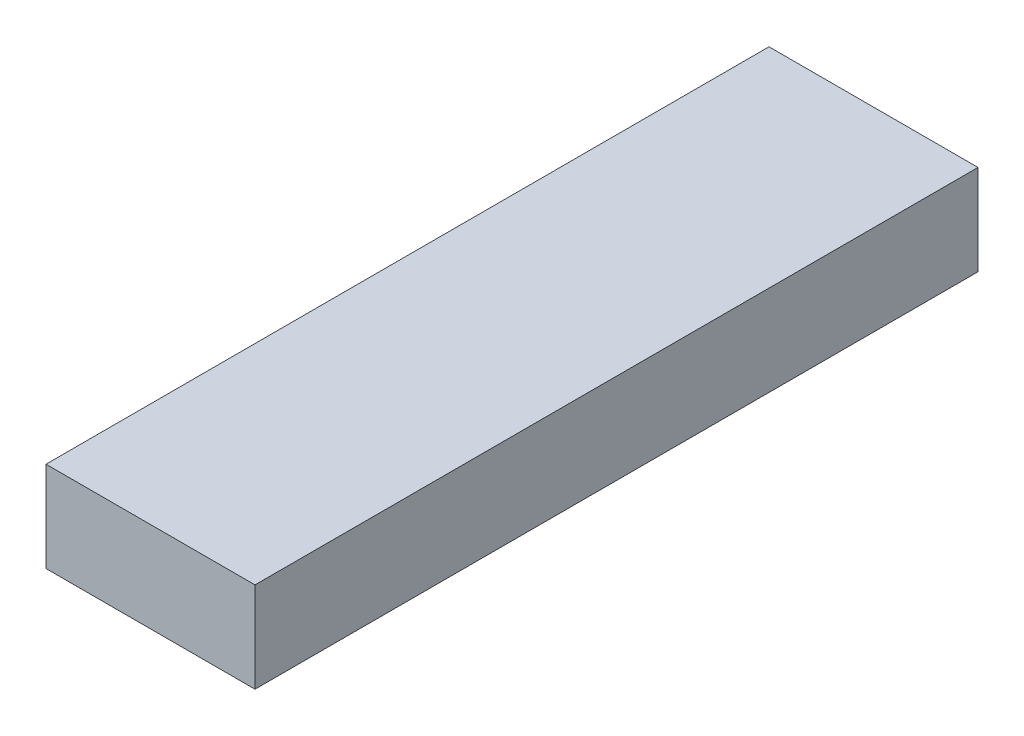
ISO-10303-21;
HEADER;
FILE_DESCRIPTION(('STEP AP214'),'2;1');
FILE_NAME('part.step','',(''),(''),'','','');
FILE_SCHEMA(('AUTOMOTIVE_DESIGN { 1 0 10303 214 1 1 1 1 }'));
ENDSEC;
DATA;
#1=APPLICATION_CONTEXT('core data for automotive mechanical design processes');
#2=APPLICATION_PROTOCOL_DEFINITION('international standard','automotive_design',2000,#1);
#3=PRODUCT_CONTEXT('',#1,'mechanical');
#4=PRODUCT('Part','Part','',(#3));
#5=PRODUCT_RELATED_PRODUCT_CATEGORY('part','',(#4));
#6=PRODUCT_DEFINITION_FORMATION('','',#4);
#7=PRODUCT_DEFINITION_CONTEXT('part definition',#1,'design');
#8=PRODUCT_DEFINITION('design','',#6,#7);
#9=PRODUCT_DEFINITION_SHAPE('','',#8);
#10=(LENGTH_UNIT() NAMED_UNIT(*) SI_UNIT(.MILLI.,.METRE.));
#11=(NAMED_UNIT(*) PLANE_ANGLE_UNIT() SI_UNIT($,.RADIAN.));
#12=(NAMED_UNIT(*) SI_UNIT($,.STERADIAN.) SOLID_ANGLE_UNIT());
#13=UNCERTAINTY_MEASURE_WITH_UNIT(LENGTH_MEASURE(1.E-05),#10,'distance_accuracy_value','');
#14=(GEOMETRIC_REPRESENTATION_CONTEXT(3) GLOBAL_UNCERTAINTY_ASSIGNED_CONTEXT((#13)) GLOBAL_UNIT_ASSIGNED_CONTEXT((#10,
#11,#12)) REPRESENTATION_CONTEXT('',''));
#15=CARTESIAN_POINT('',(0.,0.,0.));
#16=DIRECTION('',(0.,0.,1.));
#17=DIRECTION('',(1.,0.,0.));
#18=AXIS2_PLACEMENT_3D('',#15,#16,#17);
#19=CARTESIAN_POINT('',(-44.053125,-19.05,304.8));
#20=DIRECTION('',(1.,0.,0.));
#21=DIRECTION('',(0.,0.,-1.));
#22=AXIS2_PLACEMENT_3D('',#19,#20,#21);
#23=PLANE('',#22);
#24=DIRECTION('',(0.,-1.,0.));
#25=VECTOR('',#24,1.);
#26=CARTESIAN_POINT('',(-44.053125,-19.05,0.));
#27=LINE('',#26,#25);
#28=CARTESIAN_POINT('',(-44.053125,19.05,0.));
#29=VERTEX_POINT('',#28);
#30=CARTESIAN_POINT('',(-44.053125,-19.05,0.));
#31=VERTEX_POINT('',#30);
#32=EDGE_CURVE('E107',#29,#31,#27,.T.);
#33=ORIENTED_EDGE('',*,*,#32,.T.);
#34=DIRECTION('',(0.,0.,-1.));
#35=VECTOR('',#34,1.);
#36=CARTESIAN_POINT('',(-44.053125,-19.05,304.8));
#37=LINE('',#36,#35);
#38=CARTESIAN_POINT('',(-44.053125,-19.05,304.8));
#39=VERTEX_POINT('',#38);
#40=EDGE_CURVE('E11',#39,#31,#37,.T.);
#41=ORIENTED_EDGE('',*,*,#40,.F.);
#42=DIRECTION('',(0.,-1.,0.));
#43=VECTOR('',#42,1.);
#44=CARTESIAN_POINT('',(-44.053125,-19.05,304.8));
#45=LINE('',#44,#43);
#46=CARTESIAN_POINT('',(-44.053125,19.05,304.8));
#47=VERTEX_POINT('',#46);
#48=EDGE_CURVE('E91',#47,#39,#45,.T.);
#49=ORIENTED_EDGE('',*,*,#48,.F.);
#50=DIRECTION('',(0.,0.,-1.));
#51=VECTOR('',#50,1.);
#52=CARTESIAN_POINT('',(-44.053125,19.05,304.8));
#53=LINE('',#52,#51);
#54=EDGE_CURVE('E103',#47,#29,#53,.T.);
#55=ORIENTED_EDGE('',*,*,#54,.T.);
#56=EDGE_LOOP('',(#33,#41,#49,#55));
#57=FACE_BOUND('',#56,.T.);
#58=ADVANCED_FACE('F39',(#57),#23,.F.);
#59=CARTESIAN_POINT('',(44.053125,-19.05,304.8));
#60=DIRECTION('',(0.,1.,0.));
#61=DIRECTION('',(-1.,0.,0.));
#62=AXIS2_PLACEMENT_3D('',#59,#60,#61);
#63=PLANE('',#62);
#64=DIRECTION('',(1.,0.,0.));
#65=VECTOR('',#64,1.);
#66=CARTESIAN_POINT('',(44.053125,-19.05,0.));
#67=LINE('',#66,#65);
#68=CARTESIAN_POINT('',(44.053125,-19.05,0.));
#69=VERTEX_POINT('',#68);
#70=EDGE_CURVE('E96',#31,#69,#67,.T.);
#71=ORIENTED_EDGE('',*,*,#70,.T.);
#72=DIRECTION('',(0.,0.,-1.));
#73=VECTOR('',#72,1.);
#74=CARTESIAN_POINT('',(44.053125,-19.05,304.8));
#75=LINE('',#74,#73);
#76=CARTESIAN_POINT('',(44.053125,-19.05,304.8));
#77=VERTEX_POINT('',#76);
#78=EDGE_CURVE('E48',#77,#69,#75,.T.);
#79=ORIENTED_EDGE('',*,*,#78,.F.);
#80=DIRECTION('',(1.,0.,0.));
#81=VECTOR('',#80,1.);
#82=CARTESIAN_POINT('',(44.053125,-19.05,304.8));
#83=LINE('',#82,#81);
#84=EDGE_CURVE('E86',#39,#77,#83,.T.);
#85=ORIENTED_EDGE('',*,*,#84,.F.);
#86=ORIENTED_EDGE('',*,*,#40,.T.);
#87=EDGE_LOOP('',(#71,#79,#85,#86));
#88=FACE_BOUND('',#87,.T.);
#89=ADVANCED_FACE('F95',(#88),#63,.F.);
#90=CARTESIAN_POINT('',(44.053125,-19.05,304.8));
#91=DIRECTION('',(-1.,0.,0.));
#92=DIRECTION('',(0.,0.,1.));
#93=AXIS2_PLACEMENT_3D('',#90,#91,#92);
#94=PLANE('',#93);
#95=DIRECTION('',(0.,1.,0.));
#96=VECTOR('',#95,1.);
#97=CARTESIAN_POINT('',(44.053125,-19.05,0.));
#98=LINE('',#97,#96);
#99=CARTESIAN_POINT('',(44.053125,19.05,0.));
#100=VERTEX_POINT('',#99);
#101=EDGE_CURVE('E73',#69,#100,#98,.T.);
#102=ORIENTED_EDGE('',*,*,#101,.T.);
#103=DIRECTION('',(0.,0.,-1.));
#104=VECTOR('',#103,1.);
#105=CARTESIAN_POINT('',(44.053125,19.05,304.8));
#106=LINE('',#105,#104);
#107=CARTESIAN_POINT('',(44.053125,19.05,304.8));
#108=VERTEX_POINT('',#107);
#109=EDGE_CURVE('E98',#108,#100,#106,.T.);
#110=ORIENTED_EDGE('',*,*,#109,.F.);
#111=DIRECTION('',(0.,1.,0.));
#112=VECTOR('',#111,1.);
#113=CARTESIAN_POINT('',(44.053125,-19.05,304.8));
#114=LINE('',#113,#112);
#115=EDGE_CURVE('E89',#77,#108,#114,.T.);
#116=ORIENTED_EDGE('',*,*,#115,.F.);
#117=ORIENTED_EDGE('',*,*,#78,.T.);
#118=EDGE_LOOP('',(#102,#110,#116,#117));
#119=FACE_BOUND('',#118,.T.);
#120=ADVANCED_FACE('F99',(#119),#94,.F.);
#121=CARTESIAN_POINT('',(44.053125,19.05,304.8));
#122=DIRECTION('',(0.,-1.,0.));
#123=DIRECTION('',(1.,0.,0.));
#124=AXIS2_PLACEMENT_3D('',#121,#122,#123);
#125=PLANE('',#124);
#126=DIRECTION('',(-1.,0.,0.));
#127=VECTOR('',#126,1.);
#128=CARTESIAN_POINT('',(44.053125,19.05,0.));
#129=LINE('',#128,#127);
#130=EDGE_CURVE('E79',#100,#29,#129,.T.);
#131=ORIENTED_EDGE('',*,*,#130,.T.);
#132=ORIENTED_EDGE('',*,*,#54,.F.);
#133=DIRECTION('',(-1.,0.,0.));
#134=VECTOR('',#133,1.);
#135=CARTESIAN_POINT('',(44.053125,19.05,304.8));
#136=LINE('',#135,#134);
#137=EDGE_CURVE('E56',#108,#47,#136,.T.);
#138=ORIENTED_EDGE('',*,*,#137,.F.);
#139=ORIENTED_EDGE('',*,*,#109,.T.);
#140=EDGE_LOOP('',(#131,#132,#138,#139));
#141=FACE_BOUND('',#140,.T.);
#142=ADVANCED_FACE('F120',(#141),#125,.F.);
#143=CARTESIAN_POINT('',(0.,0.,304.8));
#144=DIRECTION('',(0.,0.,1.));
#145=DIRECTION('',(1.,0.,0.));
#146=AXIS2_PLACEMENT_3D('',#143,#144,#145);
#147=PLANE('',#146);
#148=ORIENTED_EDGE('',*,*,#48,.T.);
#149=ORIENTED_EDGE('',*,*,#84,.T.);
#150=ORIENTED_EDGE('',*,*,#115,.T.);
#151=ORIENTED_EDGE('',*,*,#137,.T.);
#152=EDGE_LOOP('',(#148,#149,#150,#151));
#153=FACE_BOUND('',#152,.T.);
#154=ADVANCED_FACE('F87',(#153),#147,.T.);
#155=CARTESIAN_POINT('',(0.,0.,0.));
#156=DIRECTION('',(0.,0.,1.));
#157=DIRECTION('',(1.,0.,0.));
#158=AXIS2_PLACEMENT_3D('',#155,#156,#157);
#159=PLANE('',#158);
#160=ORIENTED_EDGE('',*,*,#32,.F.);
#161=ORIENTED_EDGE('',*,*,#130,.F.);
#162=ORIENTED_EDGE('',*,*,#101,.F.);
#163=ORIENTED_EDGE('',*,*,#70,.F.);
#164=EDGE_LOOP('',(#160,#161,#162,#163));
#165=FACE_BOUND('',#164,.T.);
#166=ADVANCED_FACE('F123',(#165),#159,.F.);
#167=CLOSED_SHELL('',(#58,#89,#120,#142,#154,#166));
#168=MANIFOLD_SOLID_BREP('B2',#167);
#169=ADVANCED_BREP_SHAPE_REPRESENTATION('',(#18,#168),#14);
#170=SHAPE_DEFINITION_REPRESENTATION(#9,#169);
ENDSEC;
END-ISO-10303-21;
